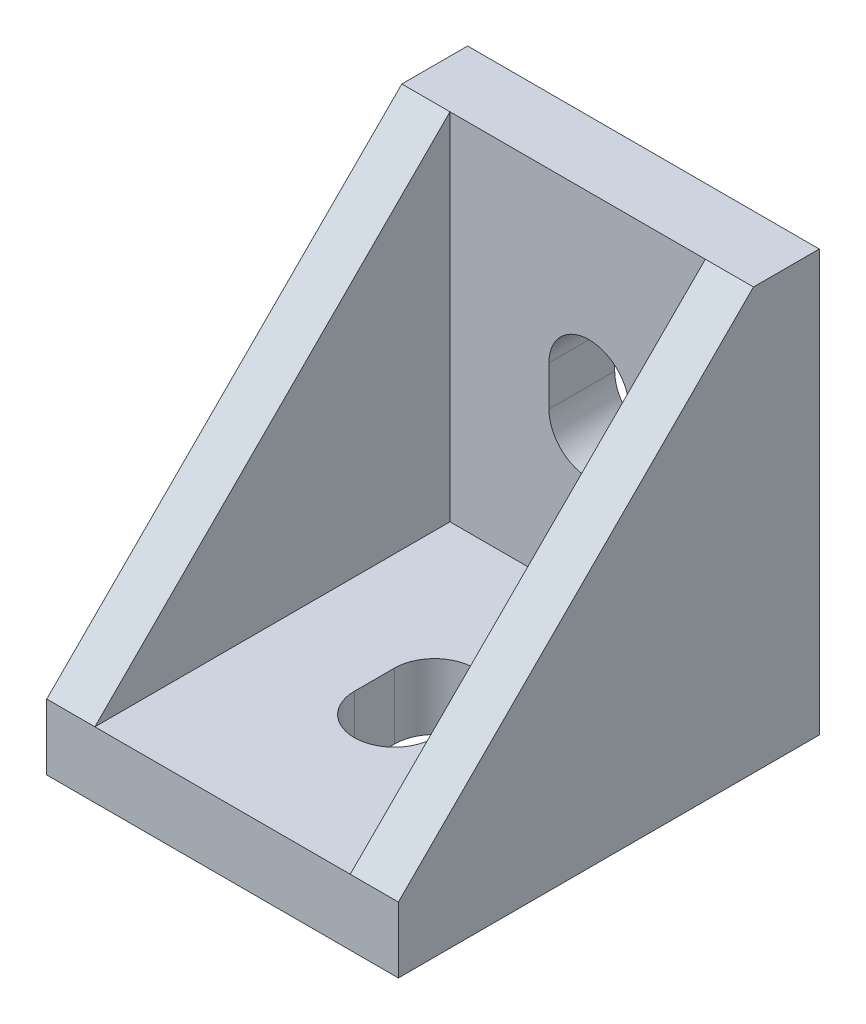
ISO-10303-21;
HEADER;
FILE_DESCRIPTION(('STEP AP214'),'2;1');
FILE_NAME('part.step','',(''),(''),'','','');
FILE_SCHEMA(('AUTOMOTIVE_DESIGN { 1 0 10303 214 1 1 1 1 }'));
ENDSEC;
DATA;
#1=APPLICATION_CONTEXT('core data for automotive mechanical design processes');
#2=APPLICATION_PROTOCOL_DEFINITION('international standard','automotive_design',2000,#1);
#3=PRODUCT_CONTEXT('',#1,'mechanical');
#4=PRODUCT('Part','Part','',(#3));
#5=PRODUCT_RELATED_PRODUCT_CATEGORY('part','',(#4));
#6=PRODUCT_DEFINITION_FORMATION('','',#4);
#7=PRODUCT_DEFINITION_CONTEXT('part definition',#1,'design');
#8=PRODUCT_DEFINITION('design','',#6,#7);
#9=PRODUCT_DEFINITION_SHAPE('','',#8);
#10=(LENGTH_UNIT() NAMED_UNIT(*) SI_UNIT(.MILLI.,.METRE.));
#11=(NAMED_UNIT(*) PLANE_ANGLE_UNIT() SI_UNIT($,.RADIAN.));
#12=(NAMED_UNIT(*) SI_UNIT($,.STERADIAN.) SOLID_ANGLE_UNIT());
#13=UNCERTAINTY_MEASURE_WITH_UNIT(LENGTH_MEASURE(1.E-05),#10,'distance_accuracy_value','');
#14=(GEOMETRIC_REPRESENTATION_CONTEXT(3) GLOBAL_UNCERTAINTY_ASSIGNED_CONTEXT((#13)) GLOBAL_UNIT_ASSIGNED_CONTEXT((#10,
#11,#12)) REPRESENTATION_CONTEXT('',''));
#15=CARTESIAN_POINT('',(0.,0.,0.));
#16=DIRECTION('',(0.,0.,1.));
#17=DIRECTION('',(1.,0.,0.));
#18=AXIS2_PLACEMENT_3D('',#15,#16,#17);
#19=CARTESIAN_POINT('',(0.,3.1242,0.));
#20=DIRECTION('',(0.,-1.,0.));
#21=DIRECTION('',(0.,0.,-1.));
#22=AXIS2_PLACEMENT_3D('',#19,#20,#21);
#23=PLANE('',#22);
#24=DIRECTION('',(0.,0.,1.));
#25=VECTOR('',#24,1.);
#26=CARTESIAN_POINT('',(-6.06425,3.1242,9.9949));
#27=LINE('',#26,#25);
#28=CARTESIAN_POINT('',(-6.06425,3.1242,-6.8707));
#29=VERTEX_POINT('',#28);
#30=CARTESIAN_POINT('',(-6.06425,3.1242,9.9949));
#31=VERTEX_POINT('',#30);
#32=EDGE_CURVE('E215',#29,#31,#27,.T.);
#33=ORIENTED_EDGE('',*,*,#32,.T.);
#34=DIRECTION('',(1.,0.,0.));
#35=VECTOR('',#34,1.);
#36=CARTESIAN_POINT('',(-8.35025,3.1242,9.9949));
#37=LINE('',#36,#35);
#38=CARTESIAN_POINT('',(6.06425,3.1242,9.9949));
#39=VERTEX_POINT('',#38);
#40=EDGE_CURVE('E260',#31,#39,#37,.T.);
#41=ORIENTED_EDGE('',*,*,#40,.T.);
#42=DIRECTION('',(0.,0.,-1.));
#43=VECTOR('',#42,1.);
#44=CARTESIAN_POINT('',(6.06425,3.1242,9.9949));
#45=LINE('',#44,#43);
#46=CARTESIAN_POINT('',(6.06425,3.1242,-6.8707));
#47=VERTEX_POINT('',#46);
#48=EDGE_CURVE('E232',#39,#47,#45,.T.);
#49=ORIENTED_EDGE('',*,*,#48,.T.);
#50=DIRECTION('',(-1.,0.,0.));
#51=VECTOR('',#50,1.);
#52=CARTESIAN_POINT('',(0.,3.1242,-6.8707));
#53=LINE('',#52,#51);
#54=EDGE_CURVE('E252',#47,#29,#53,.T.);
#55=ORIENTED_EDGE('',*,*,#54,.T.);
#56=EDGE_LOOP('',(#33,#41,#49,#55));
#57=FACE_BOUND('',#56,.T.);
#58=DIRECTION('',(0.,0.,-1.));
#59=VECTOR('',#58,1.);
#60=CARTESIAN_POINT('',(-1.36525,3.1242,0.));
#61=LINE('',#60,#59);
#62=CARTESIAN_POINT('',(-1.36525,3.1242,2.3749));
#63=VERTEX_POINT('',#62);
#64=CARTESIAN_POINT('',(-1.36525,3.1242,0.469900000000001));
#65=VERTEX_POINT('',#64);
#66=EDGE_CURVE('E49',#63,#65,#61,.T.);
#67=ORIENTED_EDGE('',*,*,#66,.T.);
#68=CARTESIAN_POINT('',(0.539749999999999,3.1242,0.469900000000001));
#69=DIRECTION('',(0.,1.,0.));
#70=DIRECTION('',(0.,0.,1.));
#71=AXIS2_PLACEMENT_3D('',#68,#69,#70);
#72=CIRCLE('',#71,1.905);
#73=CARTESIAN_POINT('',(2.43777856508048,3.1242,0.307073202025826));
#74=VERTEX_POINT('',#73);
#75=EDGE_CURVE('E159',#74,#65,#72,.T.);
#76=ORIENTED_EDGE('',*,*,#75,.F.);
#77=DIRECTION('',(-0.00337136326275236,0.,-0.999994316938727));
#78=VECTOR('',#77,1.);
#79=CARTESIAN_POINT('',(2.43671560764044,3.1242,-0.00821510016829188));
#80=LINE('',#79,#78);
#81=CARTESIAN_POINT('',(2.44475,3.1242,2.3749));
#82=VERTEX_POINT('',#81);
#83=EDGE_CURVE('E172',#82,#74,#80,.T.);
#84=ORIENTED_EDGE('',*,*,#83,.F.);
#85=CARTESIAN_POINT('',(0.539749999999999,3.1242,2.3749));
#86=DIRECTION('',(0.,1.,0.));
#87=DIRECTION('',(0.,0.,1.));
#88=AXIS2_PLACEMENT_3D('',#85,#86,#87);
#89=CIRCLE('',#88,1.905);
#90=EDGE_CURVE('E165',#63,#82,#89,.T.);
#91=ORIENTED_EDGE('',*,*,#90,.F.);
#92=EDGE_LOOP('',(#67,#76,#84,#91));
#93=FACE_BOUND('',#92,.T.);
#94=ADVANCED_FACE('F34',(#57,#93),#23,.F.);
#95=CARTESIAN_POINT('',(0.,0.,0.));
#96=DIRECTION('',(0.,-1.,0.));
#97=DIRECTION('',(0.,0.,-1.));
#98=AXIS2_PLACEMENT_3D('',#95,#96,#97);
#99=PLANE('',#98);
#100=DIRECTION('',(1.,0.,0.));
#101=VECTOR('',#100,1.);
#102=CARTESIAN_POINT('',(-8.35025,0.,9.9949));
#103=LINE('',#102,#101);
#104=CARTESIAN_POINT('',(-8.35025,0.,9.9949));
#105=VERTEX_POINT('',#104);
#106=CARTESIAN_POINT('',(8.35025,0.,9.9949));
#107=VERTEX_POINT('',#106);
#108=EDGE_CURVE('E262',#105,#107,#103,.T.);
#109=ORIENTED_EDGE('',*,*,#108,.F.);
#110=DIRECTION('',(0.,0.,1.));
#111=VECTOR('',#110,1.);
#112=CARTESIAN_POINT('',(-8.35025,0.,9.9949));
#113=LINE('',#112,#111);
#114=CARTESIAN_POINT('',(-8.35025,0.,-9.9949));
#115=VERTEX_POINT('',#114);
#116=EDGE_CURVE('E255',#115,#105,#113,.T.);
#117=ORIENTED_EDGE('',*,*,#116,.F.);
#118=DIRECTION('',(-1.,0.,0.));
#119=VECTOR('',#118,1.);
#120=CARTESIAN_POINT('',(-8.35025,0.,-9.9949));
#121=LINE('',#120,#119);
#122=CARTESIAN_POINT('',(8.35025,0.,-9.9949));
#123=VERTEX_POINT('',#122);
#124=EDGE_CURVE('E266',#123,#115,#121,.T.);
#125=ORIENTED_EDGE('',*,*,#124,.F.);
#126=DIRECTION('',(0.,0.,-1.));
#127=VECTOR('',#126,1.);
#128=CARTESIAN_POINT('',(8.35025,0.,9.9949));
#129=LINE('',#128,#127);
#130=EDGE_CURVE('E264',#107,#123,#129,.T.);
#131=ORIENTED_EDGE('',*,*,#130,.F.);
#132=EDGE_LOOP('',(#109,#117,#125,#131));
#133=FACE_BOUND('',#132,.T.);
#134=CARTESIAN_POINT('',(0.539749999999999,0.,0.469900000000001));
#135=DIRECTION('',(0.,-1.,0.));
#136=DIRECTION('',(0.,0.,-1.));
#137=AXIS2_PLACEMENT_3D('',#134,#135,#136);
#138=CIRCLE('',#137,1.905);
#139=CARTESIAN_POINT('',(2.43777856508048,0.,0.307073202025826));
#140=VERTEX_POINT('',#139);
#141=CARTESIAN_POINT('',(-1.36525,0.,0.469900000000001));
#142=VERTEX_POINT('',#141);
#143=EDGE_CURVE('E163',#140,#142,#138,.F.);
#144=ORIENTED_EDGE('',*,*,#143,.T.);
#145=DIRECTION('',(0.,0.,-1.));
#146=VECTOR('',#145,1.);
#147=CARTESIAN_POINT('',(-1.36525,0.,0.));
#148=LINE('',#147,#146);
#149=CARTESIAN_POINT('',(-1.36525,0.,2.3749));
#150=VERTEX_POINT('',#149);
#151=EDGE_CURVE('E157',#150,#142,#148,.T.);
#152=ORIENTED_EDGE('',*,*,#151,.F.);
#153=CARTESIAN_POINT('',(0.539749999999999,0.,2.3749));
#154=DIRECTION('',(0.,-1.,0.));
#155=DIRECTION('',(0.,0.,-1.));
#156=AXIS2_PLACEMENT_3D('',#153,#154,#155);
#157=CIRCLE('',#156,1.905);
#158=CARTESIAN_POINT('',(2.44475,0.,2.3749));
#159=VERTEX_POINT('',#158);
#160=EDGE_CURVE('E146',#150,#159,#157,.F.);
#161=ORIENTED_EDGE('',*,*,#160,.T.);
#162=DIRECTION('',(-0.00337136326275236,0.,-0.999994316938727));
#163=VECTOR('',#162,1.);
#164=CARTESIAN_POINT('',(2.43671560764044,0.,-0.00821510016829188));
#165=LINE('',#164,#163);
#166=EDGE_CURVE('E167',#159,#140,#165,.T.);
#167=ORIENTED_EDGE('',*,*,#166,.T.);
#168=EDGE_LOOP('',(#144,#152,#161,#167));
#169=FACE_BOUND('',#168,.T.);
#170=ADVANCED_FACE('F162',(#133,#169),#99,.T.);
#171=CARTESIAN_POINT('',(8.35025,19.9898,-6.8707));
#172=DIRECTION('',(0.,0.,1.));
#173=DIRECTION('',(1.,0.,0.));
#174=AXIS2_PLACEMENT_3D('',#171,#172,#173);
#175=PLANE('',#174);
#176=DIRECTION('',(0.,-1.,0.));
#177=VECTOR('',#176,1.);
#178=CARTESIAN_POINT('',(-1.36525,0.,-6.8707));
#179=LINE('',#178,#177);
#180=CARTESIAN_POINT('',(-1.36525,12.0142,-6.8707));
#181=VERTEX_POINT('',#180);
#182=CARTESIAN_POINT('',(-1.36525,10.1092,-6.8707));
#183=VERTEX_POINT('',#182);
#184=EDGE_CURVE('E189',#181,#183,#179,.T.);
#185=ORIENTED_EDGE('',*,*,#184,.F.);
#186=CARTESIAN_POINT('',(0.53975,12.0142,-6.8707));
#187=DIRECTION('',(0.,0.,1.));
#188=DIRECTION('',(1.,0.,0.));
#189=AXIS2_PLACEMENT_3D('',#186,#187,#188);
#190=CIRCLE('',#189,1.905);
#191=CARTESIAN_POINT('',(2.44475,12.0142,-6.8707));
#192=VERTEX_POINT('',#191);
#193=EDGE_CURVE('E197',#192,#181,#190,.T.);
#194=ORIENTED_EDGE('',*,*,#193,.F.);
#195=DIRECTION('',(0.,-1.,0.));
#196=VECTOR('',#195,1.);
#197=CARTESIAN_POINT('',(2.44475,0.,-6.8707));
#198=LINE('',#197,#196);
#199=CARTESIAN_POINT('',(2.44475,10.1092,-6.8707));
#200=VERTEX_POINT('',#199);
#201=EDGE_CURVE('E194',#192,#200,#198,.T.);
#202=ORIENTED_EDGE('',*,*,#201,.T.);
#203=CARTESIAN_POINT('',(0.53975,10.1092,-6.8707));
#204=DIRECTION('',(0.,0.,1.));
#205=DIRECTION('',(1.,0.,0.));
#206=AXIS2_PLACEMENT_3D('',#203,#204,#205);
#207=CIRCLE('',#206,1.905);
#208=EDGE_CURVE('E191',#183,#200,#207,.T.);
#209=ORIENTED_EDGE('',*,*,#208,.F.);
#210=EDGE_LOOP('',(#185,#194,#202,#209));
#211=FACE_BOUND('',#210,.T.);
#212=DIRECTION('',(-1.,0.,0.));
#213=VECTOR('',#212,1.);
#214=CARTESIAN_POINT('',(8.35025,19.9898,-6.8707));
#215=LINE('',#214,#213);
#216=CARTESIAN_POINT('',(6.06425,19.9898,-6.8707));
#217=VERTEX_POINT('',#216);
#218=CARTESIAN_POINT('',(-6.06425,19.9898,-6.8707));
#219=VERTEX_POINT('',#218);
#220=EDGE_CURVE('E242',#217,#219,#215,.T.);
#221=ORIENTED_EDGE('',*,*,#220,.T.);
#222=DIRECTION('',(0.,-1.,0.));
#223=VECTOR('',#222,1.);
#224=CARTESIAN_POINT('',(-6.06425,3.1242,-6.8707));
#225=LINE('',#224,#223);
#226=EDGE_CURVE('E213',#219,#29,#225,.T.);
#227=ORIENTED_EDGE('',*,*,#226,.T.);
#228=ORIENTED_EDGE('',*,*,#54,.F.);
#229=DIRECTION('',(0.,1.,0.));
#230=VECTOR('',#229,1.);
#231=CARTESIAN_POINT('',(6.06425,3.1242,-6.8707));
#232=LINE('',#231,#230);
#233=EDGE_CURVE('E226',#47,#217,#232,.T.);
#234=ORIENTED_EDGE('',*,*,#233,.T.);
#235=EDGE_LOOP('',(#221,#227,#228,#234));
#236=FACE_BOUND('',#235,.T.);
#237=ADVANCED_FACE('F309',(#211,#236),#175,.T.);
#238=CARTESIAN_POINT('',(-8.35025,3.1242,9.9949));
#239=DIRECTION('',(1.,0.,0.));
#240=DIRECTION('',(0.,0.,-1.));
#241=AXIS2_PLACEMENT_3D('',#238,#239,#240);
#242=PLANE('',#241);
#243=DIRECTION('',(0.,-1.,0.));
#244=VECTOR('',#243,1.);
#245=CARTESIAN_POINT('',(-8.35025,3.1242,9.9949));
#246=LINE('',#245,#244);
#247=CARTESIAN_POINT('',(-8.35025,3.1242,9.9949));
#248=VERTEX_POINT('',#247);
#249=EDGE_CURVE('E11',#248,#105,#246,.T.);
#250=ORIENTED_EDGE('',*,*,#249,.F.);
#251=DIRECTION('',(0.,0.707106781186547,-0.707106781186547));
#252=VECTOR('',#251,1.);
#253=CARTESIAN_POINT('',(-8.35025,19.9898,-6.8707));
#254=LINE('',#253,#252);
#255=CARTESIAN_POINT('',(-8.35025,19.9898,-6.8707));
#256=VERTEX_POINT('',#255);
#257=EDGE_CURVE('E212',#248,#256,#254,.T.);
#258=ORIENTED_EDGE('',*,*,#257,.T.);
#259=DIRECTION('',(0.,0.,-1.));
#260=VECTOR('',#259,1.);
#261=CARTESIAN_POINT('',(-8.35025,19.9898,-9.9949));
#262=LINE('',#261,#260);
#263=CARTESIAN_POINT('',(-8.35025,19.9898,-9.9949));
#264=VERTEX_POINT('',#263);
#265=EDGE_CURVE('E246',#256,#264,#262,.T.);
#266=ORIENTED_EDGE('',*,*,#265,.T.);
#267=DIRECTION('',(0.,-1.,0.));
#268=VECTOR('',#267,1.);
#269=CARTESIAN_POINT('',(-8.35025,3.1242,-9.9949));
#270=LINE('',#269,#268);
#271=EDGE_CURVE('E259',#264,#115,#270,.T.);
#272=ORIENTED_EDGE('',*,*,#271,.T.);
#273=ORIENTED_EDGE('',*,*,#116,.T.);
#274=EDGE_LOOP('',(#250,#258,#266,#272,#273));
#275=FACE_BOUND('',#274,.T.);
#276=ADVANCED_FACE('F36',(#275),#242,.F.);
#277=CARTESIAN_POINT('',(-8.35025,3.1242,9.9949));
#278=DIRECTION('',(0.,0.,-1.));
#279=DIRECTION('',(-1.,0.,0.));
#280=AXIS2_PLACEMENT_3D('',#277,#278,#279);
#281=PLANE('',#280);
#282=ORIENTED_EDGE('',*,*,#108,.T.);
#283=DIRECTION('',(0.,-1.,0.));
#284=VECTOR('',#283,1.);
#285=CARTESIAN_POINT('',(8.35025,3.1242,9.9949));
#286=LINE('',#285,#284);
#287=CARTESIAN_POINT('',(8.35025,3.1242,9.9949));
#288=VERTEX_POINT('',#287);
#289=EDGE_CURVE('E42',#288,#107,#286,.T.);
#290=ORIENTED_EDGE('',*,*,#289,.F.);
#291=DIRECTION('',(1.,0.,0.));
#292=VECTOR('',#291,1.);
#293=CARTESIAN_POINT('',(6.06425,3.1242,9.9949));
#294=LINE('',#293,#292);
#295=EDGE_CURVE('E234',#39,#288,#294,.T.);
#296=ORIENTED_EDGE('',*,*,#295,.F.);
#297=ORIENTED_EDGE('',*,*,#40,.F.);
#298=EDGE_CURVE('E256',#248,#31,#37,.T.);
#299=ORIENTED_EDGE('',*,*,#298,.F.);
#300=ORIENTED_EDGE('',*,*,#249,.T.);
#301=EDGE_LOOP('',(#282,#290,#296,#297,#299,#300));
#302=FACE_BOUND('',#301,.T.);
#303=ADVANCED_FACE('F297',(#302),#281,.F.);
#304=CARTESIAN_POINT('',(8.35025,3.1242,9.9949));
#305=DIRECTION('',(-1.,0.,0.));
#306=DIRECTION('',(0.,0.,1.));
#307=AXIS2_PLACEMENT_3D('',#304,#305,#306);
#308=PLANE('',#307);
#309=ORIENTED_EDGE('',*,*,#130,.T.);
#310=DIRECTION('',(0.,-1.,0.));
#311=VECTOR('',#310,1.);
#312=CARTESIAN_POINT('',(8.35025,3.1242,-9.9949));
#313=LINE('',#312,#311);
#314=CARTESIAN_POINT('',(8.35025,19.9898,-9.9949));
#315=VERTEX_POINT('',#314);
#316=EDGE_CURVE('E270',#315,#123,#313,.T.);
#317=ORIENTED_EDGE('',*,*,#316,.F.);
#318=DIRECTION('',(0.,0.,1.));
#319=VECTOR('',#318,1.);
#320=CARTESIAN_POINT('',(8.35025,19.9898,-9.9949));
#321=LINE('',#320,#319);
#322=CARTESIAN_POINT('',(8.35025,19.9898,-6.8707));
#323=VERTEX_POINT('',#322);
#324=EDGE_CURVE('E239',#315,#323,#321,.T.);
#325=ORIENTED_EDGE('',*,*,#324,.T.);
#326=DIRECTION('',(0.,-0.707106781186547,0.707106781186547));
#327=VECTOR('',#326,1.);
#328=CARTESIAN_POINT('',(8.35025,19.9898,-6.8707));
#329=LINE('',#328,#327);
#330=EDGE_CURVE('E225',#323,#288,#329,.T.);
#331=ORIENTED_EDGE('',*,*,#330,.T.);
#332=ORIENTED_EDGE('',*,*,#289,.T.);
#333=EDGE_LOOP('',(#309,#317,#325,#331,#332));
#334=FACE_BOUND('',#333,.T.);
#335=ADVANCED_FACE('F275',(#334),#308,.F.);
#336=CARTESIAN_POINT('',(-8.35025,3.1242,-9.9949));
#337=DIRECTION('',(0.,0.,1.));
#338=DIRECTION('',(1.,0.,0.));
#339=AXIS2_PLACEMENT_3D('',#336,#337,#338);
#340=PLANE('',#339);
#341=CARTESIAN_POINT('',(0.53975,12.0142,-9.9949));
#342=DIRECTION('',(0.,0.,1.));
#343=DIRECTION('',(1.,0.,0.));
#344=AXIS2_PLACEMENT_3D('',#341,#342,#343);
#345=CIRCLE('',#344,1.905);
#346=CARTESIAN_POINT('',(-1.36525,12.0142,-9.9949));
#347=VERTEX_POINT('',#346);
#348=CARTESIAN_POINT('',(2.44475,12.0142,-9.9949));
#349=VERTEX_POINT('',#348);
#350=EDGE_CURVE('E183',#347,#349,#345,.F.);
#351=ORIENTED_EDGE('',*,*,#350,.F.);
#352=DIRECTION('',(0.,1.,0.));
#353=VECTOR('',#352,1.);
#354=CARTESIAN_POINT('',(-1.36525,0.,-9.9949));
#355=LINE('',#354,#353);
#356=CARTESIAN_POINT('',(-1.36525,10.1092,-9.9949));
#357=VERTEX_POINT('',#356);
#358=EDGE_CURVE('E186',#357,#347,#355,.T.);
#359=ORIENTED_EDGE('',*,*,#358,.F.);
#360=CARTESIAN_POINT('',(0.53975,10.1092,-9.9949));
#361=DIRECTION('',(0.,0.,1.));
#362=DIRECTION('',(1.,0.,0.));
#363=AXIS2_PLACEMENT_3D('',#360,#361,#362);
#364=CIRCLE('',#363,1.905);
#365=CARTESIAN_POINT('',(2.44475,10.1092,-9.9949));
#366=VERTEX_POINT('',#365);
#367=EDGE_CURVE('E203',#366,#357,#364,.F.);
#368=ORIENTED_EDGE('',*,*,#367,.F.);
#369=DIRECTION('',(0.,1.,0.));
#370=VECTOR('',#369,1.);
#371=CARTESIAN_POINT('',(2.44475,0.,-9.9949));
#372=LINE('',#371,#370);
#373=EDGE_CURVE('E153',#366,#349,#372,.T.);
#374=ORIENTED_EDGE('',*,*,#373,.T.);
#375=EDGE_LOOP('',(#351,#359,#368,#374));
#376=FACE_BOUND('',#375,.T.);
#377=ORIENTED_EDGE('',*,*,#124,.T.);
#378=ORIENTED_EDGE('',*,*,#271,.F.);
#379=DIRECTION('',(1.,0.,0.));
#380=VECTOR('',#379,1.);
#381=CARTESIAN_POINT('',(8.35025,19.9898,-9.9949));
#382=LINE('',#381,#380);
#383=EDGE_CURVE('E249',#264,#315,#382,.T.);
#384=ORIENTED_EDGE('',*,*,#383,.T.);
#385=ORIENTED_EDGE('',*,*,#316,.T.);
#386=EDGE_LOOP('',(#377,#378,#384,#385));
#387=FACE_BOUND('',#386,.T.);
#388=ADVANCED_FACE('F284',(#376,#387),#340,.F.);
#389=CARTESIAN_POINT('',(0.,19.9898,0.));
#390=DIRECTION('',(0.,-1.,0.));
#391=DIRECTION('',(0.,0.,-1.));
#392=AXIS2_PLACEMENT_3D('',#389,#390,#391);
#393=PLANE('',#392);
#394=ORIENTED_EDGE('',*,*,#324,.F.);
#395=ORIENTED_EDGE('',*,*,#383,.F.);
#396=ORIENTED_EDGE('',*,*,#265,.F.);
#397=DIRECTION('',(-1.,0.,0.));
#398=VECTOR('',#397,1.);
#399=CARTESIAN_POINT('',(-6.06425,19.9898,-6.8707));
#400=LINE('',#399,#398);
#401=EDGE_CURVE('E220',#219,#256,#400,.T.);
#402=ORIENTED_EDGE('',*,*,#401,.F.);
#403=ORIENTED_EDGE('',*,*,#220,.F.);
#404=EDGE_CURVE('E243',#323,#217,#215,.T.);
#405=ORIENTED_EDGE('',*,*,#404,.F.);
#406=EDGE_LOOP('',(#394,#395,#396,#402,#403,#405));
#407=FACE_BOUND('',#406,.T.);
#408=ADVANCED_FACE('F291',(#407),#393,.F.);
#409=CARTESIAN_POINT('',(6.06425,19.9898,-6.8707));
#410=DIRECTION('',(0.,0.707106781186548,0.707106781186548));
#411=DIRECTION('',(0.,-0.707106781186548,0.707106781186548));
#412=AXIS2_PLACEMENT_3D('',#409,#410,#411);
#413=PLANE('',#412);
#414=ORIENTED_EDGE('',*,*,#330,.F.);
#415=ORIENTED_EDGE('',*,*,#404,.T.);
#416=DIRECTION('',(0.,-0.707106781186547,0.707106781186547));
#417=VECTOR('',#416,1.);
#418=CARTESIAN_POINT('',(6.06425,19.9898,-6.8707));
#419=LINE('',#418,#417);
#420=EDGE_CURVE('E229',#217,#39,#419,.T.);
#421=ORIENTED_EDGE('',*,*,#420,.T.);
#422=ORIENTED_EDGE('',*,*,#295,.T.);
#423=EDGE_LOOP('',(#414,#415,#421,#422));
#424=FACE_BOUND('',#423,.T.);
#425=ADVANCED_FACE('F293',(#424),#413,.T.);
#426=CARTESIAN_POINT('',(6.06425,0.,0.));
#427=DIRECTION('',(-1.,0.,0.));
#428=DIRECTION('',(0.,0.,1.));
#429=AXIS2_PLACEMENT_3D('',#426,#427,#428);
#430=PLANE('',#429);
#431=ORIENTED_EDGE('',*,*,#233,.F.);
#432=ORIENTED_EDGE('',*,*,#48,.F.);
#433=ORIENTED_EDGE('',*,*,#420,.F.);
#434=EDGE_LOOP('',(#431,#432,#433));
#435=FACE_BOUND('',#434,.T.);
#436=ADVANCED_FACE('F313',(#435),#430,.T.);
#437=CARTESIAN_POINT('',(-6.06425,19.9898,-6.8707));
#438=DIRECTION('',(0.,0.707106781186548,0.707106781186548));
#439=DIRECTION('',(0.,-0.707106781186548,0.707106781186548));
#440=AXIS2_PLACEMENT_3D('',#437,#438,#439);
#441=PLANE('',#440);
#442=ORIENTED_EDGE('',*,*,#257,.F.);
#443=ORIENTED_EDGE('',*,*,#298,.T.);
#444=DIRECTION('',(0.,0.707106781186547,-0.707106781186547));
#445=VECTOR('',#444,1.);
#446=CARTESIAN_POINT('',(-6.06425,19.9898,-6.8707));
#447=LINE('',#446,#445);
#448=EDGE_CURVE('E217',#31,#219,#447,.T.);
#449=ORIENTED_EDGE('',*,*,#448,.T.);
#450=ORIENTED_EDGE('',*,*,#401,.T.);
#451=EDGE_LOOP('',(#442,#443,#449,#450));
#452=FACE_BOUND('',#451,.T.);
#453=ADVANCED_FACE('F301',(#452),#441,.T.);
#454=CARTESIAN_POINT('',(-6.06425,0.,0.));
#455=DIRECTION('',(-1.,0.,0.));
#456=DIRECTION('',(0.,0.,1.));
#457=AXIS2_PLACEMENT_3D('',#454,#455,#456);
#458=PLANE('',#457);
#459=ORIENTED_EDGE('',*,*,#226,.F.);
#460=ORIENTED_EDGE('',*,*,#448,.F.);
#461=ORIENTED_EDGE('',*,*,#32,.F.);
#462=EDGE_LOOP('',(#459,#460,#461));
#463=FACE_BOUND('',#462,.T.);
#464=ADVANCED_FACE('F305',(#463),#458,.F.);
#465=CARTESIAN_POINT('',(-1.36525,0.,-9.9959));
#466=DIRECTION('',(-1.,0.,0.));
#467=DIRECTION('',(0.,0.,1.));
#468=AXIS2_PLACEMENT_3D('',#465,#466,#467);
#469=PLANE('',#468);
#470=ORIENTED_EDGE('',*,*,#358,.T.);
#471=DIRECTION('',(0.,0.,1.));
#472=VECTOR('',#471,1.);
#473=CARTESIAN_POINT('',(-1.36525,12.0142,-9.9959));
#474=LINE('',#473,#472);
#475=EDGE_CURVE('E201',#347,#181,#474,.T.);
#476=ORIENTED_EDGE('',*,*,#475,.T.);
#477=ORIENTED_EDGE('',*,*,#184,.T.);
#478=DIRECTION('',(0.,0.,1.));
#479=VECTOR('',#478,1.);
#480=CARTESIAN_POINT('',(-1.36525,10.1092,-9.9959));
#481=LINE('',#480,#479);
#482=EDGE_CURVE('E200',#357,#183,#481,.T.);
#483=ORIENTED_EDGE('',*,*,#482,.F.);
#484=EDGE_LOOP('',(#470,#476,#477,#483));
#485=FACE_BOUND('',#484,.T.);
#486=ADVANCED_FACE('F349',(#485),#469,.F.);
#487=CARTESIAN_POINT('',(0.53975,12.0142,-9.9959));
#488=DIRECTION('',(0.,0.,1.));
#489=DIRECTION('',(1.,0.,0.));
#490=AXIS2_PLACEMENT_3D('',#487,#488,#489);
#491=CYLINDRICAL_SURFACE('',#490,1.905);
#492=ORIENTED_EDGE('',*,*,#350,.T.);
#493=DIRECTION('',(0.,0.,1.));
#494=VECTOR('',#493,1.);
#495=CARTESIAN_POINT('',(2.44475,12.0142,-9.9959));
#496=LINE('',#495,#494);
#497=EDGE_CURVE('E204',#349,#192,#496,.T.);
#498=ORIENTED_EDGE('',*,*,#497,.T.);
#499=ORIENTED_EDGE('',*,*,#193,.T.);
#500=ORIENTED_EDGE('',*,*,#475,.F.);
#501=EDGE_LOOP('',(#492,#498,#499,#500));
#502=FACE_BOUND('',#501,.T.);
#503=ADVANCED_FACE('F357',(#502),#491,.F.);
#504=CARTESIAN_POINT('',(2.44475,0.,-9.9959));
#505=DIRECTION('',(-1.,0.,0.));
#506=DIRECTION('',(0.,0.,1.));
#507=AXIS2_PLACEMENT_3D('',#504,#505,#506);
#508=PLANE('',#507);
#509=DIRECTION('',(0.,0.,1.));
#510=VECTOR('',#509,1.);
#511=CARTESIAN_POINT('',(2.44475,10.1092,-9.9959));
#512=LINE('',#511,#510);
#513=EDGE_CURVE('E206',#366,#200,#512,.T.);
#514=ORIENTED_EDGE('',*,*,#513,.T.);
#515=ORIENTED_EDGE('',*,*,#201,.F.);
#516=ORIENTED_EDGE('',*,*,#497,.F.);
#517=ORIENTED_EDGE('',*,*,#373,.F.);
#518=EDGE_LOOP('',(#514,#515,#516,#517));
#519=FACE_BOUND('',#518,.T.);
#520=ADVANCED_FACE('F360',(#519),#508,.T.);
#521=CARTESIAN_POINT('',(0.53975,10.1092,-9.9959));
#522=DIRECTION('',(0.,0.,1.));
#523=DIRECTION('',(1.,0.,0.));
#524=AXIS2_PLACEMENT_3D('',#521,#522,#523);
#525=CYLINDRICAL_SURFACE('',#524,1.905);
#526=ORIENTED_EDGE('',*,*,#367,.T.);
#527=ORIENTED_EDGE('',*,*,#482,.T.);
#528=ORIENTED_EDGE('',*,*,#208,.T.);
#529=ORIENTED_EDGE('',*,*,#513,.F.);
#530=EDGE_LOOP('',(#526,#527,#528,#529));
#531=FACE_BOUND('',#530,.T.);
#532=ADVANCED_FACE('F351',(#531),#525,.F.);
#533=CARTESIAN_POINT('',(-1.36525,-0.00100000000000013,0.));
#534=DIRECTION('',(1.,0.,0.));
#535=DIRECTION('',(0.,0.,-1.));
#536=AXIS2_PLACEMENT_3D('',#533,#534,#535);
#537=PLANE('',#536);
#538=ORIENTED_EDGE('',*,*,#151,.T.);
#539=DIRECTION('',(0.,1.,0.));
#540=VECTOR('',#539,1.);
#541=CARTESIAN_POINT('',(-1.36525,-0.00100000000000013,0.469900000000001));
#542=LINE('',#541,#540);
#543=EDGE_CURVE('E154',#142,#65,#542,.T.);
#544=ORIENTED_EDGE('',*,*,#543,.T.);
#545=ORIENTED_EDGE('',*,*,#66,.F.);
#546=DIRECTION('',(0.,1.,0.));
#547=VECTOR('',#546,1.);
#548=CARTESIAN_POINT('',(-1.36525,-0.00100000000000013,2.3749));
#549=LINE('',#548,#547);
#550=EDGE_CURVE('E148',#150,#63,#549,.T.);
#551=ORIENTED_EDGE('',*,*,#550,.F.);
#552=EDGE_LOOP('',(#538,#544,#545,#551));
#553=FACE_BOUND('',#552,.T.);
#554=ADVANCED_FACE('F156',(#553),#537,.T.);
#555=CARTESIAN_POINT('',(0.539749999999999,-0.00100000000000013,0.469900000000001));
#556=DIRECTION('',(0.,1.,0.));
#557=DIRECTION('',(0.,0.,1.));
#558=AXIS2_PLACEMENT_3D('',#555,#556,#557);
#559=CYLINDRICAL_SURFACE('',#558,1.905);
#560=DIRECTION('',(0.,1.,0.));
#561=VECTOR('',#560,1.);
#562=CARTESIAN_POINT('',(2.43777856508048,-0.00100000000000013,0.307073202025826));
#563=LINE('',#562,#561);
#564=EDGE_CURVE('E178',#140,#74,#563,.T.);
#565=ORIENTED_EDGE('',*,*,#564,.T.);
#566=ORIENTED_EDGE('',*,*,#75,.T.);
#567=ORIENTED_EDGE('',*,*,#543,.F.);
#568=ORIENTED_EDGE('',*,*,#143,.F.);
#569=EDGE_LOOP('',(#565,#566,#567,#568));
#570=FACE_BOUND('',#569,.T.);
#571=ADVANCED_FACE('F416',(#570),#559,.F.);
#572=CARTESIAN_POINT('',(2.43671560764044,-0.00100000000000013,-0.00821510016829188));
#573=DIRECTION('',(0.999994316938727,0.,-0.00337136326275236));
#574=DIRECTION('',(-0.00337136326275236,0.,-0.999994316938727));
#575=AXIS2_PLACEMENT_3D('',#572,#573,#574);
#576=PLANE('',#575);
#577=DIRECTION('',(0.,1.,0.));
#578=VECTOR('',#577,1.);
#579=CARTESIAN_POINT('',(2.44475,-0.00100000000000013,2.3749));
#580=LINE('',#579,#578);
#581=EDGE_CURVE('E57',#159,#82,#580,.T.);
#582=ORIENTED_EDGE('',*,*,#581,.T.);
#583=ORIENTED_EDGE('',*,*,#83,.T.);
#584=ORIENTED_EDGE('',*,*,#564,.F.);
#585=ORIENTED_EDGE('',*,*,#166,.F.);
#586=EDGE_LOOP('',(#582,#583,#584,#585));
#587=FACE_BOUND('',#586,.T.);
#588=ADVANCED_FACE('F424',(#587),#576,.F.);
#589=CARTESIAN_POINT('',(0.539749999999999,-0.00100000000000013,2.3749));
#590=DIRECTION('',(0.,1.,0.));
#591=DIRECTION('',(0.,0.,1.));
#592=AXIS2_PLACEMENT_3D('',#589,#590,#591);
#593=CYLINDRICAL_SURFACE('',#592,1.905);
#594=ORIENTED_EDGE('',*,*,#550,.T.);
#595=ORIENTED_EDGE('',*,*,#90,.T.);
#596=ORIENTED_EDGE('',*,*,#581,.F.);
#597=ORIENTED_EDGE('',*,*,#160,.F.);
#598=EDGE_LOOP('',(#594,#595,#596,#597));
#599=FACE_BOUND('',#598,.T.);
#600=ADVANCED_FACE('F147',(#599),#593,.F.);
#601=CLOSED_SHELL('',(#94,#170,#237,#276,#303,#335,#388,#408,#425,#436,#453,#464,#486,#503,#520,
#532,#554,#571,#588,#600));
#602=MANIFOLD_SOLID_BREP('B2',#601);
#603=ADVANCED_BREP_SHAPE_REPRESENTATION('',(#18,#602),#14);
#604=SHAPE_DEFINITION_REPRESENTATION(#9,#603);
ENDSEC;
END-ISO-10303-21;
